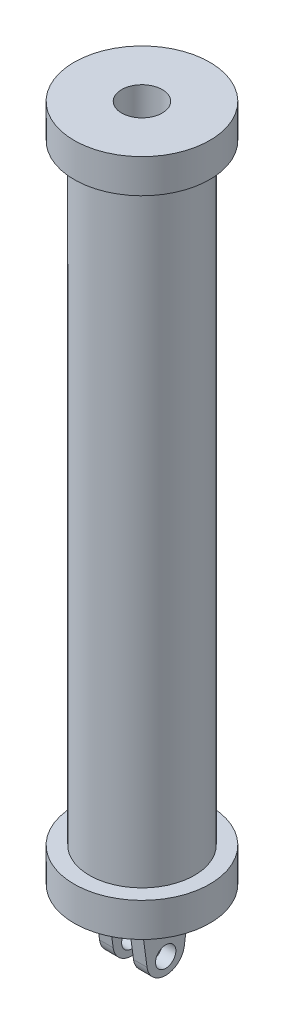
ISO-10303-21;
HEADER;
FILE_DESCRIPTION(('STEP AP214'),'2;1');
FILE_NAME('part.step','',(''),(''),'','','');
FILE_SCHEMA(('AUTOMOTIVE_DESIGN { 1 0 10303 214 1 1 1 1 }'));
ENDSEC;
DATA;
#1=APPLICATION_CONTEXT('core data for automotive mechanical design processes');
#2=APPLICATION_PROTOCOL_DEFINITION('international standard','automotive_design',2000,#1);
#3=PRODUCT_CONTEXT('',#1,'mechanical');
#4=PRODUCT('Part','Part','',(#3));
#5=PRODUCT_RELATED_PRODUCT_CATEGORY('part','',(#4));
#6=PRODUCT_DEFINITION_FORMATION('','',#4);
#7=PRODUCT_DEFINITION_CONTEXT('part definition',#1,'design');
#8=PRODUCT_DEFINITION('design','',#6,#7);
#9=PRODUCT_DEFINITION_SHAPE('','',#8);
#10=(LENGTH_UNIT() NAMED_UNIT(*) SI_UNIT(.MILLI.,.METRE.));
#11=(NAMED_UNIT(*) PLANE_ANGLE_UNIT() SI_UNIT($,.RADIAN.));
#12=(NAMED_UNIT(*) SI_UNIT($,.STERADIAN.) SOLID_ANGLE_UNIT());
#13=UNCERTAINTY_MEASURE_WITH_UNIT(LENGTH_MEASURE(1.E-05),#10,'distance_accuracy_value','');
#14=(GEOMETRIC_REPRESENTATION_CONTEXT(3) GLOBAL_UNCERTAINTY_ASSIGNED_CONTEXT((#13)) GLOBAL_UNIT_ASSIGNED_CONTEXT((#10,
#11,#12)) REPRESENTATION_CONTEXT('',''));
#15=CARTESIAN_POINT('',(0.,0.,0.));
#16=DIRECTION('',(0.,0.,1.));
#17=DIRECTION('',(1.,0.,0.));
#18=AXIS2_PLACEMENT_3D('',#15,#16,#17);
#19=CARTESIAN_POINT('',(0.,100.,0.));
#20=DIRECTION('',(0.,-1.,0.));
#21=DIRECTION('',(1.,0.,0.));
#22=AXIS2_PLACEMENT_3D('',#19,#20,#21);
#23=PLANE('',#22);
#24=CARTESIAN_POINT('',(0.,100.,0.));
#25=DIRECTION('',(0.,1.,0.));
#26=DIRECTION('',(-1.,0.,0.));
#27=AXIS2_PLACEMENT_3D('',#24,#25,#26);
#28=CIRCLE('',#27,3.);
#29=CARTESIAN_POINT('',(-3.,100.,0.));
#30=VERTEX_POINT('',#29);
#31=EDGE_CURVE('E176',#30,#30,#28,.T.);
#32=ORIENTED_EDGE('',*,*,#31,.F.);
#33=EDGE_LOOP('',(#32));
#34=FACE_BOUND('',#33,.T.);
#35=CARTESIAN_POINT('',(0.,100.,0.));
#36=DIRECTION('',(0.,1.,0.));
#37=DIRECTION('',(-1.,0.,0.));
#38=AXIS2_PLACEMENT_3D('',#35,#36,#37);
#39=CIRCLE('',#38,10.);
#40=CARTESIAN_POINT('',(-10.,100.,0.));
#41=VERTEX_POINT('',#40);
#42=EDGE_CURVE('E197',#41,#41,#39,.T.);
#43=ORIENTED_EDGE('',*,*,#42,.T.);
#44=EDGE_LOOP('',(#43));
#45=FACE_BOUND('',#44,.T.);
#46=ADVANCED_FACE('F36',(#34,#45),#23,.F.);
#47=CARTESIAN_POINT('',(0.,100.,0.));
#48=DIRECTION('',(0.,1.,0.));
#49=DIRECTION('',(-1.,0.,0.));
#50=AXIS2_PLACEMENT_3D('',#47,#48,#49);
#51=CYLINDRICAL_SURFACE('',#50,10.);
#52=ORIENTED_EDGE('',*,*,#42,.F.);
#53=EDGE_LOOP('',(#52));
#54=FACE_BOUND('',#53,.T.);
#55=CARTESIAN_POINT('',(0.,95.,0.));
#56=DIRECTION('',(0.,1.,0.));
#57=DIRECTION('',(-1.,0.,0.));
#58=AXIS2_PLACEMENT_3D('',#55,#56,#57);
#59=CIRCLE('',#58,10.);
#60=CARTESIAN_POINT('',(-10.,95.,0.));
#61=VERTEX_POINT('',#60);
#62=EDGE_CURVE('E194',#61,#61,#59,.T.);
#63=ORIENTED_EDGE('',*,*,#62,.T.);
#64=EDGE_LOOP('',(#63));
#65=FACE_BOUND('',#64,.T.);
#66=ADVANCED_FACE('F220',(#54,#65),#51,.T.);
#67=CARTESIAN_POINT('',(10.,95.,0.));
#68=DIRECTION('',(0.,1.,0.));
#69=DIRECTION('',(-1.,0.,0.));
#70=AXIS2_PLACEMENT_3D('',#67,#68,#69);
#71=PLANE('',#70);
#72=ORIENTED_EDGE('',*,*,#62,.F.);
#73=EDGE_LOOP('',(#72));
#74=FACE_BOUND('',#73,.T.);
#75=CARTESIAN_POINT('',(0.,95.,0.));
#76=DIRECTION('',(0.,1.,0.));
#77=DIRECTION('',(-1.,0.,0.));
#78=AXIS2_PLACEMENT_3D('',#75,#76,#77);
#79=CIRCLE('',#78,7.75);
#80=CARTESIAN_POINT('',(-7.75,95.,0.));
#81=VERTEX_POINT('',#80);
#82=EDGE_CURVE('E191',#81,#81,#79,.T.);
#83=ORIENTED_EDGE('',*,*,#82,.T.);
#84=EDGE_LOOP('',(#83));
#85=FACE_BOUND('',#84,.T.);
#86=ADVANCED_FACE('F225',(#74,#85),#71,.F.);
#87=CARTESIAN_POINT('',(0.,100.,0.));
#88=DIRECTION('',(0.,1.,0.));
#89=DIRECTION('',(-1.,0.,0.));
#90=AXIS2_PLACEMENT_3D('',#87,#88,#89);
#91=CYLINDRICAL_SURFACE('',#90,7.75000000000001);
#92=ORIENTED_EDGE('',*,*,#82,.F.);
#93=EDGE_LOOP('',(#92));
#94=FACE_BOUND('',#93,.T.);
#95=CARTESIAN_POINT('',(0.,5.,0.));
#96=DIRECTION('',(0.,1.,0.));
#97=DIRECTION('',(-1.,0.,0.));
#98=AXIS2_PLACEMENT_3D('',#95,#96,#97);
#99=CIRCLE('',#98,7.75000000000001);
#100=CARTESIAN_POINT('',(-7.75000000000001,5.,0.));
#101=VERTEX_POINT('',#100);
#102=EDGE_CURVE('E188',#101,#101,#99,.T.);
#103=ORIENTED_EDGE('',*,*,#102,.T.);
#104=EDGE_LOOP('',(#103));
#105=FACE_BOUND('',#104,.T.);
#106=ADVANCED_FACE('F233',(#94,#105),#91,.T.);
#107=CARTESIAN_POINT('',(7.75000000000001,5.,0.));
#108=DIRECTION('',(0.,-1.,0.));
#109=DIRECTION('',(1.,0.,0.));
#110=AXIS2_PLACEMENT_3D('',#107,#108,#109);
#111=PLANE('',#110);
#112=ORIENTED_EDGE('',*,*,#102,.F.);
#113=EDGE_LOOP('',(#112));
#114=FACE_BOUND('',#113,.T.);
#115=CARTESIAN_POINT('',(0.,5.,0.));
#116=DIRECTION('',(0.,1.,0.));
#117=DIRECTION('',(-1.,0.,0.));
#118=AXIS2_PLACEMENT_3D('',#115,#116,#117);
#119=CIRCLE('',#118,10.);
#120=CARTESIAN_POINT('',(-10.,5.,0.));
#121=VERTEX_POINT('',#120);
#122=EDGE_CURVE('E185',#121,#121,#119,.T.);
#123=ORIENTED_EDGE('',*,*,#122,.T.);
#124=EDGE_LOOP('',(#123));
#125=FACE_BOUND('',#124,.T.);
#126=ADVANCED_FACE('F237',(#114,#125),#111,.F.);
#127=CARTESIAN_POINT('',(0.,100.,0.));
#128=DIRECTION('',(0.,1.,0.));
#129=DIRECTION('',(-1.,0.,0.));
#130=AXIS2_PLACEMENT_3D('',#127,#128,#129);
#131=CYLINDRICAL_SURFACE('',#130,10.);
#132=ORIENTED_EDGE('',*,*,#122,.F.);
#133=EDGE_LOOP('',(#132));
#134=FACE_BOUND('',#133,.T.);
#135=CARTESIAN_POINT('',(0.,0.,0.));
#136=DIRECTION('',(0.,1.,0.));
#137=DIRECTION('',(-1.,0.,0.));
#138=AXIS2_PLACEMENT_3D('',#135,#136,#137);
#139=CIRCLE('',#138,10.);
#140=CARTESIAN_POINT('',(-10.,0.,0.));
#141=VERTEX_POINT('',#140);
#142=EDGE_CURVE('E182',#141,#141,#139,.T.);
#143=ORIENTED_EDGE('',*,*,#142,.T.);
#144=EDGE_LOOP('',(#143));
#145=FACE_BOUND('',#144,.T.);
#146=ADVANCED_FACE('F241',(#134,#145),#131,.T.);
#147=CARTESIAN_POINT('',(10.,0.,0.));
#148=DIRECTION('',(0.,1.,0.));
#149=DIRECTION('',(-1.,0.,0.));
#150=AXIS2_PLACEMENT_3D('',#147,#148,#149);
#151=PLANE('',#150);
#152=DIRECTION('',(1.,0.,0.));
#153=VECTOR('',#152,1.);
#154=CARTESIAN_POINT('',(0.,0.,3.75));
#155=LINE('',#154,#153);
#156=CARTESIAN_POINT('',(-3.5,0.,3.75));
#157=VERTEX_POINT('',#156);
#158=CARTESIAN_POINT('',(-1.5,0.,3.75));
#159=VERTEX_POINT('',#158);
#160=EDGE_CURVE('E166',#157,#159,#155,.T.);
#161=ORIENTED_EDGE('',*,*,#160,.T.);
#162=DIRECTION('',(0.,0.,-1.));
#163=VECTOR('',#162,1.);
#164=CARTESIAN_POINT('',(-1.5,0.,0.));
#165=LINE('',#164,#163);
#166=CARTESIAN_POINT('',(-1.5,0.,-3.75));
#167=VERTEX_POINT('',#166);
#168=EDGE_CURVE('E173',#159,#167,#165,.T.);
#169=ORIENTED_EDGE('',*,*,#168,.T.);
#170=DIRECTION('',(1.,0.,0.));
#171=VECTOR('',#170,1.);
#172=CARTESIAN_POINT('',(0.,0.,-3.75));
#173=LINE('',#172,#171);
#174=CARTESIAN_POINT('',(-3.5,0.,-3.75));
#175=VERTEX_POINT('',#174);
#176=EDGE_CURVE('E59',#175,#167,#173,.T.);
#177=ORIENTED_EDGE('',*,*,#176,.F.);
#178=DIRECTION('',(0.,0.,1.));
#179=VECTOR('',#178,1.);
#180=CARTESIAN_POINT('',(-3.5,0.,0.));
#181=LINE('',#180,#179);
#182=EDGE_CURVE('E169',#175,#157,#181,.T.);
#183=ORIENTED_EDGE('',*,*,#182,.T.);
#184=EDGE_LOOP('',(#161,#169,#177,#183));
#185=FACE_BOUND('',#184,.T.);
#186=DIRECTION('',(0.,0.,-1.));
#187=VECTOR('',#186,1.);
#188=CARTESIAN_POINT('',(1.5,0.,0.));
#189=LINE('',#188,#187);
#190=CARTESIAN_POINT('',(1.5,0.,3.75));
#191=VERTEX_POINT('',#190);
#192=CARTESIAN_POINT('',(1.5,0.,-3.75));
#193=VERTEX_POINT('',#192);
#194=EDGE_CURVE('E160',#191,#193,#189,.T.);
#195=ORIENTED_EDGE('',*,*,#194,.F.);
#196=DIRECTION('',(1.,0.,0.));
#197=VECTOR('',#196,1.);
#198=CARTESIAN_POINT('',(0.,0.,3.75));
#199=LINE('',#198,#197);
#200=CARTESIAN_POINT('',(3.5,0.,3.75));
#201=VERTEX_POINT('',#200);
#202=EDGE_CURVE('E157',#191,#201,#199,.T.);
#203=ORIENTED_EDGE('',*,*,#202,.T.);
#204=DIRECTION('',(0.,0.,1.));
#205=VECTOR('',#204,1.);
#206=CARTESIAN_POINT('',(3.5,0.,0.));
#207=LINE('',#206,#205);
#208=CARTESIAN_POINT('',(3.5,0.,-3.75));
#209=VERTEX_POINT('',#208);
#210=EDGE_CURVE('E164',#209,#201,#207,.T.);
#211=ORIENTED_EDGE('',*,*,#210,.F.);
#212=DIRECTION('',(1.,0.,0.));
#213=VECTOR('',#212,1.);
#214=CARTESIAN_POINT('',(0.,0.,-3.75));
#215=LINE('',#214,#213);
#216=EDGE_CURVE('E51',#193,#209,#215,.T.);
#217=ORIENTED_EDGE('',*,*,#216,.F.);
#218=EDGE_LOOP('',(#195,#203,#211,#217));
#219=FACE_BOUND('',#218,.T.);
#220=ORIENTED_EDGE('',*,*,#142,.F.);
#221=EDGE_LOOP('',(#220));
#222=FACE_BOUND('',#221,.T.);
#223=ADVANCED_FACE('F245',(#185,#219,#222),#151,.F.);
#224=CARTESIAN_POINT('',(0.,86.5147186257614,0.));
#225=DIRECTION('',(0.,1.,0.));
#226=DIRECTION('',(-1.,0.,0.));
#227=AXIS2_PLACEMENT_3D('',#224,#225,#226);
#228=CYLINDRICAL_SURFACE('',#227,3.);
#229=CARTESIAN_POINT('',(0.,95.,0.));
#230=DIRECTION('',(0.,1.,0.));
#231=DIRECTION('',(-1.,0.,0.));
#232=AXIS2_PLACEMENT_3D('',#229,#230,#231);
#233=CIRCLE('',#232,3.);
#234=CARTESIAN_POINT('',(-3.,95.,0.));
#235=VERTEX_POINT('',#234);
#236=EDGE_CURVE('E179',#235,#235,#233,.F.);
#237=ORIENTED_EDGE('',*,*,#236,.T.);
#238=EDGE_LOOP('',(#237));
#239=FACE_BOUND('',#238,.T.);
#240=ORIENTED_EDGE('',*,*,#31,.T.);
#241=EDGE_LOOP('',(#240));
#242=FACE_BOUND('',#241,.T.);
#243=ADVANCED_FACE('F249',(#239,#242),#228,.F.);
#244=CARTESIAN_POINT('',(5.00000000000001,5.00000000000002,0.));
#245=DIRECTION('',(0.,-1.,0.));
#246=DIRECTION('',(1.,0.,0.));
#247=AXIS2_PLACEMENT_3D('',#244,#245,#246);
#248=PLANE('',#247);
#249=CARTESIAN_POINT('',(0.,5.00000000000002,0.));
#250=DIRECTION('',(0.,1.,0.));
#251=DIRECTION('',(-1.,0.,0.));
#252=AXIS2_PLACEMENT_3D('',#249,#250,#251);
#253=CIRCLE('',#252,5.00000000000001);
#254=CARTESIAN_POINT('',(-5.00000000000001,5.00000000000002,0.));
#255=VERTEX_POINT('',#254);
#256=EDGE_CURVE('E11',#255,#255,#253,.T.);
#257=ORIENTED_EDGE('',*,*,#256,.T.);
#258=EDGE_LOOP('',(#257));
#259=FACE_BOUND('',#258,.T.);
#260=ADVANCED_FACE('F38',(#259),#248,.F.);
#261=CARTESIAN_POINT('',(0.,100.,0.));
#262=DIRECTION('',(0.,1.,0.));
#263=DIRECTION('',(-1.,0.,0.));
#264=AXIS2_PLACEMENT_3D('',#261,#262,#263);
#265=CYLINDRICAL_SURFACE('',#264,5.);
#266=ORIENTED_EDGE('',*,*,#256,.F.);
#267=EDGE_LOOP('',(#266));
#268=FACE_BOUND('',#267,.T.);
#269=CARTESIAN_POINT('',(0.,95.,0.));
#270=DIRECTION('',(0.,1.,0.));
#271=DIRECTION('',(-1.,0.,0.));
#272=AXIS2_PLACEMENT_3D('',#269,#270,#271);
#273=CIRCLE('',#272,5.);
#274=CARTESIAN_POINT('',(-5.,95.,0.));
#275=VERTEX_POINT('',#274);
#276=EDGE_CURVE('E44',#275,#275,#273,.T.);
#277=ORIENTED_EDGE('',*,*,#276,.T.);
#278=EDGE_LOOP('',(#277));
#279=FACE_BOUND('',#278,.T.);
#280=ADVANCED_FACE('F202',(#268,#279),#265,.F.);
#281=CARTESIAN_POINT('',(0.,95.,0.));
#282=DIRECTION('',(0.,1.,0.));
#283=DIRECTION('',(-1.,0.,0.));
#284=AXIS2_PLACEMENT_3D('',#281,#282,#283);
#285=PLANE('',#284);
#286=ORIENTED_EDGE('',*,*,#236,.F.);
#287=EDGE_LOOP('',(#286));
#288=FACE_BOUND('',#287,.T.);
#289=ORIENTED_EDGE('',*,*,#276,.F.);
#290=EDGE_LOOP('',(#289));
#291=FACE_BOUND('',#290,.T.);
#292=ADVANCED_FACE('F204',(#288,#291),#285,.F.);
#293=CARTESIAN_POINT('',(-3.5,-10.,0.));
#294=DIRECTION('',(-1.,0.,0.));
#295=DIRECTION('',(0.,-1.,0.));
#296=AXIS2_PLACEMENT_3D('',#293,#294,#295);
#297=PLANE('',#296);
#298=DIRECTION('',(0.,-0.991227900682635,-0.132163720091018));
#299=VECTOR('',#298,1.);
#300=CARTESIAN_POINT('',(-3.5,-10.3165938864629,2.37445414847162));
#301=LINE('',#300,#299);
#302=CARTESIAN_POINT('',(-3.5,-7.5,2.75));
#303=VERTEX_POINT('',#302);
#304=EDGE_CURVE('E155',#157,#303,#301,.T.);
#305=ORIENTED_EDGE('',*,*,#304,.F.);
#306=ORIENTED_EDGE('',*,*,#182,.F.);
#307=DIRECTION('',(0.,0.991227900682635,-0.132163720091018));
#308=VECTOR('',#307,1.);
#309=CARTESIAN_POINT('',(-3.5,-10.3165938864629,-2.37445414847162));
#310=LINE('',#309,#308);
#311=CARTESIAN_POINT('',(-3.5,-7.5,-2.75));
#312=VERTEX_POINT('',#311);
#313=EDGE_CURVE('E143',#312,#175,#310,.T.);
#314=ORIENTED_EDGE('',*,*,#313,.F.);
#315=CARTESIAN_POINT('',(-3.5,-7.13333333333332,0.));
#316=DIRECTION('',(-1.,0.,0.));
#317=DIRECTION('',(0.,-1.,0.));
#318=AXIS2_PLACEMENT_3D('',#315,#316,#317);
#319=CIRCLE('',#318,2.77433675757729);
#320=EDGE_CURVE('E148',#303,#312,#319,.F.);
#321=ORIENTED_EDGE('',*,*,#320,.F.);
#322=EDGE_LOOP('',(#305,#306,#314,#321));
#323=FACE_BOUND('',#322,.T.);
#324=CARTESIAN_POINT('',(-3.5,-7.5,0.));
#325=DIRECTION('',(-1.,0.,0.));
#326=DIRECTION('',(0.,-1.,0.));
#327=AXIS2_PLACEMENT_3D('',#324,#325,#326);
#328=CIRCLE('',#327,1.5);
#329=CARTESIAN_POINT('',(-3.5,-9.,0.));
#330=VERTEX_POINT('',#329);
#331=EDGE_CURVE('E136',#330,#330,#328,.T.);
#332=ORIENTED_EDGE('',*,*,#331,.F.);
#333=EDGE_LOOP('',(#332));
#334=FACE_BOUND('',#333,.T.);
#335=ADVANCED_FACE('F206',(#323,#334),#297,.T.);
#336=CARTESIAN_POINT('',(-1.5,-10.,0.));
#337=DIRECTION('',(1.,0.,0.));
#338=DIRECTION('',(0.,0.,-1.));
#339=AXIS2_PLACEMENT_3D('',#336,#337,#338);
#340=PLANE('',#339);
#341=DIRECTION('',(0.,0.991227900682635,0.132163720091018));
#342=VECTOR('',#341,1.);
#343=CARTESIAN_POINT('',(-1.5,-10.3165938864629,2.37445414847162));
#344=LINE('',#343,#342);
#345=CARTESIAN_POINT('',(-1.5,-7.5,2.75));
#346=VERTEX_POINT('',#345);
#347=EDGE_CURVE('E153',#346,#159,#344,.T.);
#348=ORIENTED_EDGE('',*,*,#347,.F.);
#349=CARTESIAN_POINT('',(-1.5,-7.13333333333332,0.));
#350=DIRECTION('',(1.,0.,0.));
#351=DIRECTION('',(0.,0.,-1.));
#352=AXIS2_PLACEMENT_3D('',#349,#350,#351);
#353=CIRCLE('',#352,2.77433675757729);
#354=CARTESIAN_POINT('',(-1.5,-7.5,-2.75));
#355=VERTEX_POINT('',#354);
#356=EDGE_CURVE('E146',#355,#346,#353,.F.);
#357=ORIENTED_EDGE('',*,*,#356,.F.);
#358=DIRECTION('',(0.,-0.991227900682635,0.132163720091018));
#359=VECTOR('',#358,1.);
#360=CARTESIAN_POINT('',(-1.5,-10.3165938864629,-2.37445414847162));
#361=LINE('',#360,#359);
#362=EDGE_CURVE('E141',#167,#355,#361,.T.);
#363=ORIENTED_EDGE('',*,*,#362,.F.);
#364=ORIENTED_EDGE('',*,*,#168,.F.);
#365=EDGE_LOOP('',(#348,#357,#363,#364));
#366=FACE_BOUND('',#365,.T.);
#367=CARTESIAN_POINT('',(-1.5,-7.5,0.));
#368=DIRECTION('',(1.,0.,0.));
#369=DIRECTION('',(0.,0.,-1.));
#370=AXIS2_PLACEMENT_3D('',#367,#368,#369);
#371=CIRCLE('',#370,1.5);
#372=CARTESIAN_POINT('',(-1.5,-7.5,-1.5));
#373=VERTEX_POINT('',#372);
#374=EDGE_CURVE('E133',#373,#373,#371,.T.);
#375=ORIENTED_EDGE('',*,*,#374,.F.);
#376=EDGE_LOOP('',(#375));
#377=FACE_BOUND('',#376,.T.);
#378=ADVANCED_FACE('F213',(#366,#377),#340,.T.);
#379=CARTESIAN_POINT('',(1.5,-10.,0.));
#380=DIRECTION('',(1.,0.,0.));
#381=DIRECTION('',(0.,0.,-1.));
#382=AXIS2_PLACEMENT_3D('',#379,#380,#381);
#383=PLANE('',#382);
#384=CARTESIAN_POINT('',(1.5,-7.5,0.));
#385=DIRECTION('',(1.,0.,0.));
#386=DIRECTION('',(0.,0.,-1.));
#387=AXIS2_PLACEMENT_3D('',#384,#385,#386);
#388=CIRCLE('',#387,1.5);
#389=CARTESIAN_POINT('',(1.5,-7.5,-1.5));
#390=VERTEX_POINT('',#389);
#391=EDGE_CURVE('E130',#390,#390,#388,.T.);
#392=ORIENTED_EDGE('',*,*,#391,.T.);
#393=EDGE_LOOP('',(#392));
#394=FACE_BOUND('',#393,.T.);
#395=CARTESIAN_POINT('',(1.5,-7.13333333333332,0.));
#396=DIRECTION('',(1.,0.,0.));
#397=DIRECTION('',(0.,0.,-1.));
#398=AXIS2_PLACEMENT_3D('',#395,#396,#397);
#399=CIRCLE('',#398,2.77433675757729);
#400=CARTESIAN_POINT('',(1.5,-7.5,-2.75));
#401=VERTEX_POINT('',#400);
#402=CARTESIAN_POINT('',(1.5,-7.5,2.75));
#403=VERTEX_POINT('',#402);
#404=EDGE_CURVE('E109',#401,#403,#399,.F.);
#405=ORIENTED_EDGE('',*,*,#404,.T.);
#406=DIRECTION('',(0.,0.991227900682635,0.132163720091018));
#407=VECTOR('',#406,1.);
#408=CARTESIAN_POINT('',(1.5,-10.3165938864629,2.37445414847162));
#409=LINE('',#408,#407);
#410=EDGE_CURVE('E150',#403,#191,#409,.T.);
#411=ORIENTED_EDGE('',*,*,#410,.T.);
#412=ORIENTED_EDGE('',*,*,#194,.T.);
#413=DIRECTION('',(0.,-0.991227900682635,0.132163720091018));
#414=VECTOR('',#413,1.);
#415=CARTESIAN_POINT('',(1.5,-10.3165938864629,-2.37445414847162));
#416=LINE('',#415,#414);
#417=EDGE_CURVE('E139',#193,#401,#416,.T.);
#418=ORIENTED_EDGE('',*,*,#417,.T.);
#419=EDGE_LOOP('',(#405,#411,#412,#418));
#420=FACE_BOUND('',#419,.T.);
#421=ADVANCED_FACE('F256',(#394,#420),#383,.F.);
#422=CARTESIAN_POINT('',(3.5,-10.,0.));
#423=DIRECTION('',(-1.,0.,0.));
#424=DIRECTION('',(0.,-1.,0.));
#425=AXIS2_PLACEMENT_3D('',#422,#423,#424);
#426=PLANE('',#425);
#427=CARTESIAN_POINT('',(3.5,-7.5,0.));
#428=DIRECTION('',(1.,0.,0.));
#429=DIRECTION('',(0.,1.,0.));
#430=AXIS2_PLACEMENT_3D('',#427,#428,#429);
#431=CIRCLE('',#430,1.5);
#432=CARTESIAN_POINT('',(3.5,-6.,0.));
#433=VERTEX_POINT('',#432);
#434=EDGE_CURVE('E127',#433,#433,#431,.T.);
#435=ORIENTED_EDGE('',*,*,#434,.F.);
#436=EDGE_LOOP('',(#435));
#437=FACE_BOUND('',#436,.T.);
#438=ORIENTED_EDGE('',*,*,#210,.T.);
#439=DIRECTION('',(0.,0.991227900682635,0.132163720091018));
#440=VECTOR('',#439,1.);
#441=CARTESIAN_POINT('',(3.5,0.,3.75));
#442=LINE('',#441,#440);
#443=CARTESIAN_POINT('',(3.5,-7.5,2.75));
#444=VERTEX_POINT('',#443);
#445=EDGE_CURVE('E112',#444,#201,#442,.T.);
#446=ORIENTED_EDGE('',*,*,#445,.F.);
#447=CARTESIAN_POINT('',(3.5,-7.13333333333332,0.));
#448=DIRECTION('',(-1.,0.,0.));
#449=DIRECTION('',(0.,1.,0.));
#450=AXIS2_PLACEMENT_3D('',#447,#448,#449);
#451=CIRCLE('',#450,2.77433675757729);
#452=CARTESIAN_POINT('',(3.5,-7.5,-2.75));
#453=VERTEX_POINT('',#452);
#454=EDGE_CURVE('E106',#453,#444,#451,.T.);
#455=ORIENTED_EDGE('',*,*,#454,.F.);
#456=DIRECTION('',(0.,-0.991227900682635,0.132163720091018));
#457=VECTOR('',#456,1.);
#458=CARTESIAN_POINT('',(3.5,-7.5,-2.75));
#459=LINE('',#458,#457);
#460=EDGE_CURVE('E114',#209,#453,#459,.T.);
#461=ORIENTED_EDGE('',*,*,#460,.F.);
#462=EDGE_LOOP('',(#438,#446,#455,#461));
#463=FACE_BOUND('',#462,.T.);
#464=ADVANCED_FACE('F120',(#437,#463),#426,.F.);
#465=CARTESIAN_POINT('',(-6.5,-7.5,0.));
#466=DIRECTION('',(1.,0.,0.));
#467=DIRECTION('',(0.,1.,0.));
#468=AXIS2_PLACEMENT_3D('',#465,#466,#467);
#469=CYLINDRICAL_SURFACE('',#468,1.5);
#470=ORIENTED_EDGE('',*,*,#434,.T.);
#471=EDGE_LOOP('',(#470));
#472=FACE_BOUND('',#471,.T.);
#473=ORIENTED_EDGE('',*,*,#391,.F.);
#474=EDGE_LOOP('',(#473));
#475=FACE_BOUND('',#474,.T.);
#476=ADVANCED_FACE('F263',(#472,#475),#469,.F.);
#477=CARTESIAN_POINT('',(-6.5,-7.5,-2.75));
#478=DIRECTION('',(0.,0.132163720091018,0.991227900682635));
#479=DIRECTION('',(0.,-0.991227900682635,0.132163720091018));
#480=AXIS2_PLACEMENT_3D('',#477,#478,#479);
#481=PLANE('',#480);
#482=ORIENTED_EDGE('',*,*,#216,.T.);
#483=ORIENTED_EDGE('',*,*,#460,.T.);
#484=DIRECTION('',(1.,0.,0.));
#485=VECTOR('',#484,1.);
#486=CARTESIAN_POINT('',(-6.5,-7.5,-2.75));
#487=LINE('',#486,#485);
#488=EDGE_CURVE('E102',#401,#453,#487,.T.);
#489=ORIENTED_EDGE('',*,*,#488,.F.);
#490=ORIENTED_EDGE('',*,*,#417,.F.);
#491=EDGE_LOOP('',(#482,#483,#489,#490));
#492=FACE_BOUND('',#491,.T.);
#493=ADVANCED_FACE('F115',(#492),#481,.F.);
#494=CARTESIAN_POINT('',(-6.5,-7.13333333333332,0.));
#495=DIRECTION('',(1.,0.,0.));
#496=DIRECTION('',(0.,1.,0.));
#497=AXIS2_PLACEMENT_3D('',#494,#495,#496);
#498=CYLINDRICAL_SURFACE('',#497,2.77433675757729);
#499=ORIENTED_EDGE('',*,*,#488,.T.);
#500=ORIENTED_EDGE('',*,*,#454,.T.);
#501=DIRECTION('',(1.,0.,0.));
#502=VECTOR('',#501,1.);
#503=CARTESIAN_POINT('',(-6.5,-7.5,2.75));
#504=LINE('',#503,#502);
#505=EDGE_CURVE('E124',#403,#444,#504,.T.);
#506=ORIENTED_EDGE('',*,*,#505,.F.);
#507=ORIENTED_EDGE('',*,*,#404,.F.);
#508=EDGE_LOOP('',(#499,#500,#506,#507));
#509=FACE_BOUND('',#508,.T.);
#510=ADVANCED_FACE('F103',(#509),#498,.T.);
#511=CARTESIAN_POINT('',(-6.5,0.,3.75));
#512=DIRECTION('',(0.,0.132163720091018,-0.991227900682635));
#513=DIRECTION('',(0.,0.991227900682635,0.132163720091018));
#514=AXIS2_PLACEMENT_3D('',#511,#512,#513);
#515=PLANE('',#514);
#516=ORIENTED_EDGE('',*,*,#505,.T.);
#517=ORIENTED_EDGE('',*,*,#445,.T.);
#518=ORIENTED_EDGE('',*,*,#202,.F.);
#519=ORIENTED_EDGE('',*,*,#410,.F.);
#520=EDGE_LOOP('',(#516,#517,#518,#519));
#521=FACE_BOUND('',#520,.T.);
#522=ADVANCED_FACE('F269',(#521),#515,.F.);
#523=ORIENTED_EDGE('',*,*,#331,.T.);
#524=EDGE_LOOP('',(#523));
#525=FACE_BOUND('',#524,.T.);
#526=ORIENTED_EDGE('',*,*,#374,.T.);
#527=EDGE_LOOP('',(#526));
#528=FACE_BOUND('',#527,.T.);
#529=ADVANCED_FACE('F265',(#525,#528),#469,.F.);
#530=ORIENTED_EDGE('',*,*,#304,.T.);
#531=EDGE_CURVE('E125',#303,#346,#504,.T.);
#532=ORIENTED_EDGE('',*,*,#531,.T.);
#533=ORIENTED_EDGE('',*,*,#347,.T.);
#534=ORIENTED_EDGE('',*,*,#160,.F.);
#535=EDGE_LOOP('',(#530,#532,#533,#534));
#536=FACE_BOUND('',#535,.T.);
#537=ADVANCED_FACE('F268',(#536),#515,.F.);
#538=ORIENTED_EDGE('',*,*,#320,.T.);
#539=EDGE_CURVE('E111',#312,#355,#487,.T.);
#540=ORIENTED_EDGE('',*,*,#539,.T.);
#541=ORIENTED_EDGE('',*,*,#356,.T.);
#542=ORIENTED_EDGE('',*,*,#531,.F.);
#543=EDGE_LOOP('',(#538,#540,#541,#542));
#544=FACE_BOUND('',#543,.T.);
#545=ADVANCED_FACE('F274',(#544),#498,.T.);
#546=ORIENTED_EDGE('',*,*,#313,.T.);
#547=ORIENTED_EDGE('',*,*,#176,.T.);
#548=ORIENTED_EDGE('',*,*,#362,.T.);
#549=ORIENTED_EDGE('',*,*,#539,.F.);
#550=EDGE_LOOP('',(#546,#547,#548,#549));
#551=FACE_BOUND('',#550,.T.);
#552=ADVANCED_FACE('F271',(#551),#481,.F.);
#553=CLOSED_SHELL('',(#46,#66,#86,#106,#126,#146,#223,#243,#260,#280,#292,#335,#378,#421,#464,
#476,#493,#510,#522,#529,#537,#545,#552));
#554=MANIFOLD_SOLID_BREP('B2',#553);
#555=ADVANCED_BREP_SHAPE_REPRESENTATION('',(#18,#554),#14);
#556=SHAPE_DEFINITION_REPRESENTATION(#9,#555);
ENDSEC;
END-ISO-10303-21;
